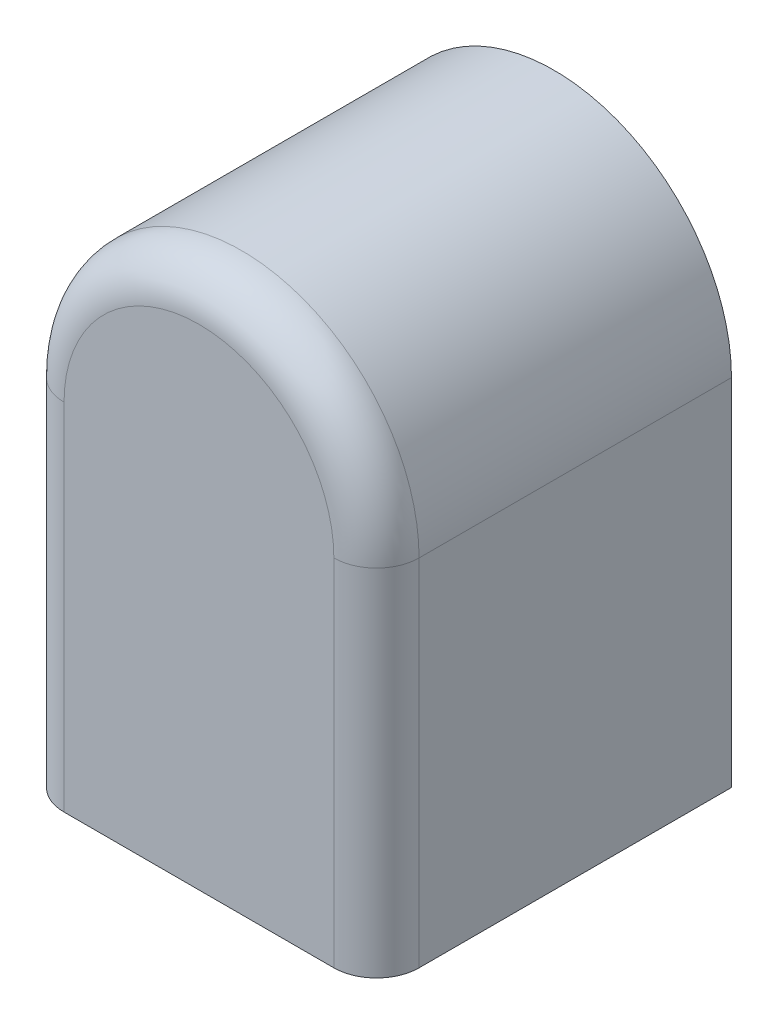
ISO-10303-21;
HEADER;
FILE_DESCRIPTION(('STEP AP214'),'2;1');
FILE_NAME('part.step','',(''),(''),'','','');
FILE_SCHEMA(('AUTOMOTIVE_DESIGN { 1 0 10303 214 1 1 1 1 }'));
ENDSEC;
DATA;
#1=APPLICATION_CONTEXT('core data for automotive mechanical design processes');
#2=APPLICATION_PROTOCOL_DEFINITION('international standard','automotive_design',2000,#1);
#3=PRODUCT_CONTEXT('',#1,'mechanical');
#4=PRODUCT('Part','Part','',(#3));
#5=PRODUCT_RELATED_PRODUCT_CATEGORY('part','',(#4));
#6=PRODUCT_DEFINITION_FORMATION('','',#4);
#7=PRODUCT_DEFINITION_CONTEXT('part definition',#1,'design');
#8=PRODUCT_DEFINITION('design','',#6,#7);
#9=PRODUCT_DEFINITION_SHAPE('','',#8);
#10=(LENGTH_UNIT() NAMED_UNIT(*) SI_UNIT(.MILLI.,.METRE.));
#11=(NAMED_UNIT(*) PLANE_ANGLE_UNIT() SI_UNIT($,.RADIAN.));
#12=(NAMED_UNIT(*) SI_UNIT($,.STERADIAN.) SOLID_ANGLE_UNIT());
#13=UNCERTAINTY_MEASURE_WITH_UNIT(LENGTH_MEASURE(1.E-05),#10,'distance_accuracy_value','');
#14=(GEOMETRIC_REPRESENTATION_CONTEXT(3) GLOBAL_UNCERTAINTY_ASSIGNED_CONTEXT((#13)) GLOBAL_UNIT_ASSIGNED_CONTEXT((#10,
#11,#12)) REPRESENTATION_CONTEXT('',''));
#15=CARTESIAN_POINT('',(0.,0.,0.));
#16=DIRECTION('',(0.,0.,1.));
#17=DIRECTION('',(1.,0.,0.));
#18=AXIS2_PLACEMENT_3D('',#15,#16,#17);
#19=CARTESIAN_POINT('',(0.,0.,25.));
#20=DIRECTION('',(0.,0.,-1.));
#21=DIRECTION('',(-1.,0.,0.));
#22=AXIS2_PLACEMENT_3D('',#19,#20,#21);
#23=CYLINDRICAL_SURFACE('',#22,12.5);
#24=DIRECTION('',(0.,0.,-1.));
#25=VECTOR('',#24,1.);
#26=CARTESIAN_POINT('',(-12.5,0.,25.));
#27=LINE('',#26,#25);
#28=CARTESIAN_POINT('',(-12.5,0.,22.));
#29=VERTEX_POINT('',#28);
#30=CARTESIAN_POINT('',(-12.5,0.,0.));
#31=VERTEX_POINT('',#30);
#32=EDGE_CURVE('E87',#29,#31,#27,.T.);
#33=ORIENTED_EDGE('',*,*,#32,.F.);
#34=CARTESIAN_POINT('',(0.,0.,22.));
#35=DIRECTION('',(0.,0.,-1.));
#36=DIRECTION('',(-1.,0.,0.));
#37=AXIS2_PLACEMENT_3D('',#34,#35,#36);
#38=CIRCLE('',#37,12.5);
#39=CARTESIAN_POINT('',(12.5,0.,22.));
#40=VERTEX_POINT('',#39);
#41=EDGE_CURVE('E11',#29,#40,#38,.T.);
#42=ORIENTED_EDGE('',*,*,#41,.T.);
#43=DIRECTION('',(0.,0.,-1.));
#44=VECTOR('',#43,1.);
#45=CARTESIAN_POINT('',(12.5,0.,25.));
#46=LINE('',#45,#44);
#47=CARTESIAN_POINT('',(12.5,0.,0.));
#48=VERTEX_POINT('',#47);
#49=EDGE_CURVE('E104',#40,#48,#46,.T.);
#50=ORIENTED_EDGE('',*,*,#49,.T.);
#51=CARTESIAN_POINT('',(0.,0.,0.));
#52=DIRECTION('',(0.,0.,1.));
#53=DIRECTION('',(-1.,0.,0.));
#54=AXIS2_PLACEMENT_3D('',#51,#52,#53);
#55=CIRCLE('',#54,12.5);
#56=EDGE_CURVE('E100',#48,#31,#55,.T.);
#57=ORIENTED_EDGE('',*,*,#56,.T.);
#58=EDGE_LOOP('',(#33,#42,#50,#57));
#59=FACE_BOUND('',#58,.T.);
#60=ADVANCED_FACE('F35',(#59),#23,.T.);
#61=CARTESIAN_POINT('',(-12.5,0.,25.));
#62=DIRECTION('',(1.,0.,0.));
#63=DIRECTION('',(0.,1.,0.));
#64=AXIS2_PLACEMENT_3D('',#61,#62,#63);
#65=PLANE('',#64);
#66=DIRECTION('',(0.,0.,-1.));
#67=VECTOR('',#66,1.);
#68=CARTESIAN_POINT('',(-12.5,-25.,25.));
#69=LINE('',#68,#67);
#70=CARTESIAN_POINT('',(-12.5,-25.,22.));
#71=VERTEX_POINT('',#70);
#72=CARTESIAN_POINT('',(-12.5,-25.,0.));
#73=VERTEX_POINT('',#72);
#74=EDGE_CURVE('E94',#71,#73,#69,.T.);
#75=ORIENTED_EDGE('',*,*,#74,.F.);
#76=DIRECTION('',(0.,-1.,0.));
#77=VECTOR('',#76,1.);
#78=CARTESIAN_POINT('',(-12.5,0.,22.));
#79=LINE('',#78,#77);
#80=EDGE_CURVE('E58',#71,#29,#79,.F.);
#81=ORIENTED_EDGE('',*,*,#80,.T.);
#82=ORIENTED_EDGE('',*,*,#32,.T.);
#83=DIRECTION('',(0.,-1.,0.));
#84=VECTOR('',#83,1.);
#85=CARTESIAN_POINT('',(-12.5,0.,0.));
#86=LINE('',#85,#84);
#87=EDGE_CURVE('E90',#31,#73,#86,.T.);
#88=ORIENTED_EDGE('',*,*,#87,.T.);
#89=EDGE_LOOP('',(#75,#81,#82,#88));
#90=FACE_BOUND('',#89,.T.);
#91=ADVANCED_FACE('F89',(#90),#65,.F.);
#92=CARTESIAN_POINT('',(-12.5,-25.,25.));
#93=DIRECTION('',(0.,1.,0.));
#94=DIRECTION('',(0.,0.,1.));
#95=AXIS2_PLACEMENT_3D('',#92,#93,#94);
#96=PLANE('',#95);
#97=DIRECTION('',(1.,0.,0.));
#98=VECTOR('',#97,1.);
#99=CARTESIAN_POINT('',(-12.5,-25.,25.));
#100=LINE('',#99,#98);
#101=CARTESIAN_POINT('',(-9.5,-25.,25.));
#102=VERTEX_POINT('',#101);
#103=CARTESIAN_POINT('',(9.49999999999999,-25.,25.));
#104=VERTEX_POINT('',#103);
#105=EDGE_CURVE('E110',#102,#104,#100,.T.);
#106=ORIENTED_EDGE('',*,*,#105,.F.);
#107=CARTESIAN_POINT('',(-9.5,-25.,22.));
#108=DIRECTION('',(0.,1.,0.));
#109=DIRECTION('',(0.,0.,1.));
#110=AXIS2_PLACEMENT_3D('',#107,#108,#109);
#111=CIRCLE('',#110,3.);
#112=EDGE_CURVE('E127',#102,#71,#111,.F.);
#113=ORIENTED_EDGE('',*,*,#112,.T.);
#114=ORIENTED_EDGE('',*,*,#74,.T.);
#115=DIRECTION('',(1.,0.,0.));
#116=VECTOR('',#115,1.);
#117=CARTESIAN_POINT('',(-12.5,-25.,0.));
#118=LINE('',#117,#116);
#119=CARTESIAN_POINT('',(12.5,-25.,0.));
#120=VERTEX_POINT('',#119);
#121=EDGE_CURVE('E102',#73,#120,#118,.T.);
#122=ORIENTED_EDGE('',*,*,#121,.T.);
#123=DIRECTION('',(0.,0.,-1.));
#124=VECTOR('',#123,1.);
#125=CARTESIAN_POINT('',(12.5,-25.,25.));
#126=LINE('',#125,#124);
#127=CARTESIAN_POINT('',(12.5,-25.,22.));
#128=VERTEX_POINT('',#127);
#129=EDGE_CURVE('E116',#128,#120,#126,.T.);
#130=ORIENTED_EDGE('',*,*,#129,.F.);
#131=CARTESIAN_POINT('',(9.5,-25.,22.));
#132=DIRECTION('',(0.,1.,0.));
#133=DIRECTION('',(0.,0.,1.));
#134=AXIS2_PLACEMENT_3D('',#131,#132,#133);
#135=CIRCLE('',#134,3.);
#136=EDGE_CURVE('E125',#128,#104,#135,.F.);
#137=ORIENTED_EDGE('',*,*,#136,.T.);
#138=EDGE_LOOP('',(#106,#113,#114,#122,#130,#137));
#139=FACE_BOUND('',#138,.T.);
#140=ADVANCED_FACE('F148',(#139),#96,.F.);
#141=CARTESIAN_POINT('',(12.5,-25.,25.));
#142=DIRECTION('',(-1.,0.,0.));
#143=DIRECTION('',(0.,0.,1.));
#144=AXIS2_PLACEMENT_3D('',#141,#142,#143);
#145=PLANE('',#144);
#146=ORIENTED_EDGE('',*,*,#49,.F.);
#147=DIRECTION('',(0.,1.,0.));
#148=VECTOR('',#147,1.);
#149=CARTESIAN_POINT('',(12.5,-25.,22.));
#150=LINE('',#149,#148);
#151=EDGE_CURVE('E44',#40,#128,#150,.F.);
#152=ORIENTED_EDGE('',*,*,#151,.T.);
#153=ORIENTED_EDGE('',*,*,#129,.T.);
#154=DIRECTION('',(0.,1.,0.));
#155=VECTOR('',#154,1.);
#156=CARTESIAN_POINT('',(12.5,-25.,0.));
#157=LINE('',#156,#155);
#158=EDGE_CURVE('E113',#120,#48,#157,.T.);
#159=ORIENTED_EDGE('',*,*,#158,.T.);
#160=EDGE_LOOP('',(#146,#152,#153,#159));
#161=FACE_BOUND('',#160,.T.);
#162=ADVANCED_FACE('F145',(#161),#145,.F.);
#163=CARTESIAN_POINT('',(0.,0.,25.));
#164=DIRECTION('',(0.,0.,-1.));
#165=DIRECTION('',(-1.,0.,0.));
#166=AXIS2_PLACEMENT_3D('',#163,#164,#165);
#167=PLANE('',#166);
#168=CARTESIAN_POINT('',(0.,0.,25.));
#169=DIRECTION('',(0.,0.,-1.));
#170=DIRECTION('',(-1.,0.,0.));
#171=AXIS2_PLACEMENT_3D('',#168,#169,#170);
#172=CIRCLE('',#171,9.5);
#173=CARTESIAN_POINT('',(9.5,0.,25.));
#174=VERTEX_POINT('',#173);
#175=CARTESIAN_POINT('',(-9.5,0.,25.));
#176=VERTEX_POINT('',#175);
#177=EDGE_CURVE('E93',#174,#176,#172,.F.);
#178=ORIENTED_EDGE('',*,*,#177,.T.);
#179=DIRECTION('',(0.,-1.,0.));
#180=VECTOR('',#179,1.);
#181=CARTESIAN_POINT('',(-9.5,0.,25.));
#182=LINE('',#181,#180);
#183=EDGE_CURVE('E122',#176,#102,#182,.T.);
#184=ORIENTED_EDGE('',*,*,#183,.T.);
#185=ORIENTED_EDGE('',*,*,#105,.T.);
#186=DIRECTION('',(0.,1.,0.));
#187=VECTOR('',#186,1.);
#188=CARTESIAN_POINT('',(9.5,0.,25.));
#189=LINE('',#188,#187);
#190=EDGE_CURVE('E120',#104,#174,#189,.T.);
#191=ORIENTED_EDGE('',*,*,#190,.T.);
#192=EDGE_LOOP('',(#178,#184,#185,#191));
#193=FACE_BOUND('',#192,.T.);
#194=ADVANCED_FACE('F151',(#193),#167,.F.);
#195=CARTESIAN_POINT('',(0.,0.,0.));
#196=DIRECTION('',(0.,0.,-1.));
#197=DIRECTION('',(-1.,0.,0.));
#198=AXIS2_PLACEMENT_3D('',#195,#196,#197);
#199=PLANE('',#198);
#200=ORIENTED_EDGE('',*,*,#56,.F.);
#201=ORIENTED_EDGE('',*,*,#158,.F.);
#202=ORIENTED_EDGE('',*,*,#121,.F.);
#203=ORIENTED_EDGE('',*,*,#87,.F.);
#204=EDGE_LOOP('',(#200,#201,#202,#203));
#205=FACE_BOUND('',#204,.T.);
#206=ADVANCED_FACE('F98',(#205),#199,.T.);
#207=CARTESIAN_POINT('',(9.5,0.,22.));
#208=DIRECTION('',(0.,1.,0.));
#209=DIRECTION('',(0.,0.,1.));
#210=AXIS2_PLACEMENT_3D('',#207,#208,#209);
#211=CYLINDRICAL_SURFACE('',#210,3.);
#212=ORIENTED_EDGE('',*,*,#136,.F.);
#213=ORIENTED_EDGE('',*,*,#151,.F.);
#214=CARTESIAN_POINT('',(9.5,0.,22.));
#215=DIRECTION('',(0.,1.,0.));
#216=DIRECTION('',(0.,0.,1.));
#217=AXIS2_PLACEMENT_3D('',#214,#215,#216);
#218=CIRCLE('',#217,3.);
#219=EDGE_CURVE('E39',#174,#40,#218,.T.);
#220=ORIENTED_EDGE('',*,*,#219,.F.);
#221=ORIENTED_EDGE('',*,*,#190,.F.);
#222=EDGE_LOOP('',(#212,#213,#220,#221));
#223=FACE_BOUND('',#222,.T.);
#224=ADVANCED_FACE('F37',(#223),#211,.T.);
#225=CARTESIAN_POINT('',(0.,0.,22.));
#226=DIRECTION('',(0.,0.,-1.));
#227=DIRECTION('',(-1.,0.,0.));
#228=AXIS2_PLACEMENT_3D('',#225,#226,#227);
#229=TOROIDAL_SURFACE('',#228,9.5,3.);
#230=ORIENTED_EDGE('',*,*,#219,.T.);
#231=ORIENTED_EDGE('',*,*,#41,.F.);
#232=CARTESIAN_POINT('',(-9.5,0.,22.));
#233=DIRECTION('',(0.,-1.,0.));
#234=DIRECTION('',(1.,0.,0.));
#235=AXIS2_PLACEMENT_3D('',#232,#233,#234);
#236=CIRCLE('',#235,3.);
#237=EDGE_CURVE('E108',#176,#29,#236,.T.);
#238=ORIENTED_EDGE('',*,*,#237,.F.);
#239=ORIENTED_EDGE('',*,*,#177,.F.);
#240=EDGE_LOOP('',(#230,#231,#238,#239));
#241=FACE_BOUND('',#240,.T.);
#242=ADVANCED_FACE('F137',(#241),#229,.T.);
#243=CARTESIAN_POINT('',(-9.5,0.,22.));
#244=DIRECTION('',(0.,-1.,0.));
#245=DIRECTION('',(1.,0.,0.));
#246=AXIS2_PLACEMENT_3D('',#243,#244,#245);
#247=CYLINDRICAL_SURFACE('',#246,3.);
#248=ORIENTED_EDGE('',*,*,#237,.T.);
#249=ORIENTED_EDGE('',*,*,#80,.F.);
#250=ORIENTED_EDGE('',*,*,#112,.F.);
#251=ORIENTED_EDGE('',*,*,#183,.F.);
#252=EDGE_LOOP('',(#248,#249,#250,#251));
#253=FACE_BOUND('',#252,.T.);
#254=ADVANCED_FACE('F134',(#253),#247,.T.);
#255=CLOSED_SHELL('',(#60,#91,#140,#162,#194,#206,#224,#242,#254));
#256=MANIFOLD_SOLID_BREP('B2',#255);
#257=ADVANCED_BREP_SHAPE_REPRESENTATION('',(#18,#256),#14);
#258=SHAPE_DEFINITION_REPRESENTATION(#9,#257);
ENDSEC;
END-ISO-10303-21;
